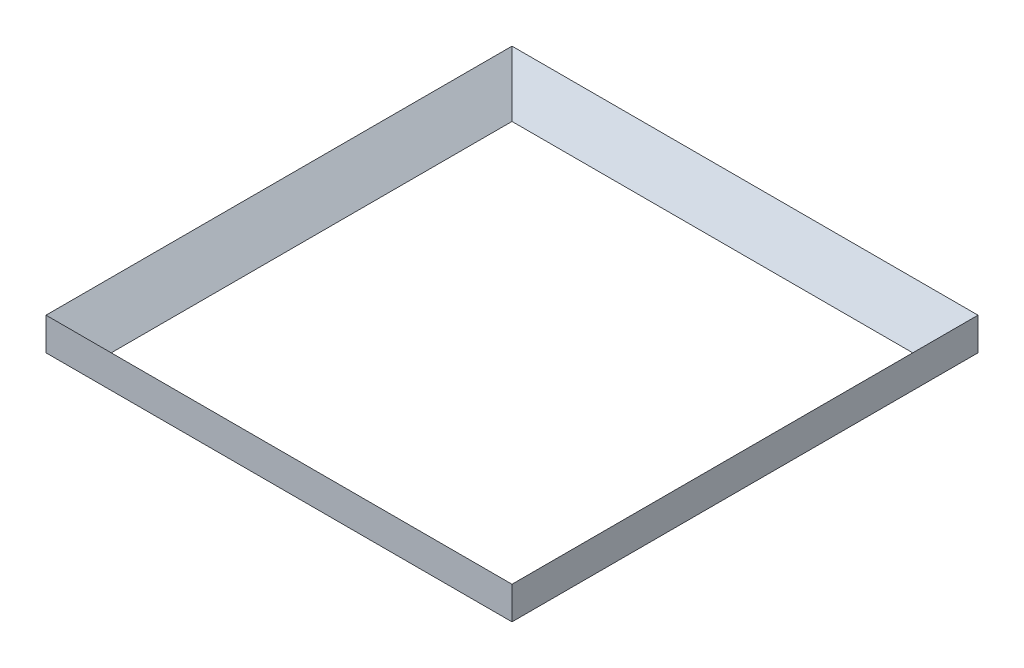
ISO-10303-21;
HEADER;
FILE_DESCRIPTION(('STEP AP214'),'2;1');
FILE_NAME('part.step','',(''),(''),'','','');
FILE_SCHEMA(('AUTOMOTIVE_DESIGN { 1 0 10303 214 1 1 1 1 }'));
ENDSEC;
DATA;
#1=APPLICATION_CONTEXT('core data for automotive mechanical design processes');
#2=APPLICATION_PROTOCOL_DEFINITION('international standard','automotive_design',2000,#1);
#3=PRODUCT_CONTEXT('',#1,'mechanical');
#4=PRODUCT('Part','Part','',(#3));
#5=PRODUCT_RELATED_PRODUCT_CATEGORY('part','',(#4));
#6=PRODUCT_DEFINITION_FORMATION('','',#4);
#7=PRODUCT_DEFINITION_CONTEXT('part definition',#1,'design');
#8=PRODUCT_DEFINITION('design','',#6,#7);
#9=PRODUCT_DEFINITION_SHAPE('','',#8);
#10=(LENGTH_UNIT() NAMED_UNIT(*) SI_UNIT(.MILLI.,.METRE.));
#11=(NAMED_UNIT(*) PLANE_ANGLE_UNIT() SI_UNIT($,.RADIAN.));
#12=(NAMED_UNIT(*) SI_UNIT($,.STERADIAN.) SOLID_ANGLE_UNIT());
#13=UNCERTAINTY_MEASURE_WITH_UNIT(LENGTH_MEASURE(1.E-05),#10,'distance_accuracy_value','');
#14=(GEOMETRIC_REPRESENTATION_CONTEXT(3) GLOBAL_UNCERTAINTY_ASSIGNED_CONTEXT((#13)) GLOBAL_UNIT_ASSIGNED_CONTEXT((#10,
#11,#12)) REPRESENTATION_CONTEXT('',''));
#15=CARTESIAN_POINT('',(0.,0.,0.));
#16=DIRECTION('',(0.,0.,1.));
#17=DIRECTION('',(1.,0.,0.));
#18=AXIS2_PLACEMENT_3D('',#15,#16,#17);
#19=CARTESIAN_POINT('',(50.,3.5,0.));
#20=DIRECTION('',(1.,0.,0.));
#21=DIRECTION('',(0.,0.,-1.));
#22=AXIS2_PLACEMENT_3D('',#19,#20,#21);
#23=PLANE('',#22);
#24=DIRECTION('',(0.,0.,1.));
#25=VECTOR('',#24,1.);
#26=CARTESIAN_POINT('',(50.,0.,0.));
#27=LINE('',#26,#25);
#28=CARTESIAN_POINT('',(50.,0.,-50.));
#29=VERTEX_POINT('',#28);
#30=CARTESIAN_POINT('',(50.,0.,0.));
#31=VERTEX_POINT('',#30);
#32=EDGE_CURVE('E94',#29,#31,#27,.T.);
#33=ORIENTED_EDGE('',*,*,#32,.F.);
#34=DIRECTION('',(0.,-1.,0.));
#35=VECTOR('',#34,1.);
#36=CARTESIAN_POINT('',(50.,3.5,-50.));
#37=LINE('',#36,#35);
#38=CARTESIAN_POINT('',(50.,3.5,-50.));
#39=VERTEX_POINT('',#38);
#40=EDGE_CURVE('E11',#39,#29,#37,.T.);
#41=ORIENTED_EDGE('',*,*,#40,.F.);
#42=DIRECTION('',(0.,0.,1.));
#43=VECTOR('',#42,1.);
#44=CARTESIAN_POINT('',(50.,3.5,0.));
#45=LINE('',#44,#43);
#46=CARTESIAN_POINT('',(50.,3.5,0.));
#47=VERTEX_POINT('',#46);
#48=EDGE_CURVE('E54',#39,#47,#45,.T.);
#49=ORIENTED_EDGE('',*,*,#48,.T.);
#50=DIRECTION('',(0.,-1.,0.));
#51=VECTOR('',#50,1.);
#52=CARTESIAN_POINT('',(50.,3.5,0.));
#53=LINE('',#52,#51);
#54=EDGE_CURVE('E86',#47,#31,#53,.T.);
#55=ORIENTED_EDGE('',*,*,#54,.T.);
#56=EDGE_LOOP('',(#33,#41,#49,#55));
#57=FACE_BOUND('',#56,.T.);
#58=ADVANCED_FACE('F39',(#57),#23,.T.);
#59=CARTESIAN_POINT('',(0.,3.5,-50.));
#60=DIRECTION('',(0.,0.,-1.));
#61=DIRECTION('',(-1.,0.,0.));
#62=AXIS2_PLACEMENT_3D('',#59,#60,#61);
#63=PLANE('',#62);
#64=DIRECTION('',(1.,0.,0.));
#65=VECTOR('',#64,1.);
#66=CARTESIAN_POINT('',(0.,0.,-50.));
#67=LINE('',#66,#65);
#68=CARTESIAN_POINT('',(0.,0.,-50.));
#69=VERTEX_POINT('',#68);
#70=EDGE_CURVE('E99',#69,#29,#67,.T.);
#71=ORIENTED_EDGE('',*,*,#70,.F.);
#72=DIRECTION('',(0.,-1.,0.));
#73=VECTOR('',#72,1.);
#74=CARTESIAN_POINT('',(0.,3.5,-50.));
#75=LINE('',#74,#73);
#76=CARTESIAN_POINT('',(0.,3.5,-50.));
#77=VERTEX_POINT('',#76);
#78=EDGE_CURVE('E47',#77,#69,#75,.T.);
#79=ORIENTED_EDGE('',*,*,#78,.F.);
#80=DIRECTION('',(1.,0.,0.));
#81=VECTOR('',#80,1.);
#82=CARTESIAN_POINT('',(0.,3.5,-50.));
#83=LINE('',#82,#81);
#84=EDGE_CURVE('E111',#77,#39,#83,.T.);
#85=ORIENTED_EDGE('',*,*,#84,.T.);
#86=ORIENTED_EDGE('',*,*,#40,.T.);
#87=EDGE_LOOP('',(#71,#79,#85,#86));
#88=FACE_BOUND('',#87,.T.);
#89=ADVANCED_FACE('F156',(#88),#63,.T.);
#90=CARTESIAN_POINT('',(0.,3.5,0.));
#91=DIRECTION('',(-1.,0.,0.));
#92=DIRECTION('',(0.,0.,1.));
#93=AXIS2_PLACEMENT_3D('',#90,#91,#92);
#94=PLANE('',#93);
#95=DIRECTION('',(0.,0.,-1.));
#96=VECTOR('',#95,1.);
#97=CARTESIAN_POINT('',(0.,0.,0.));
#98=LINE('',#97,#96);
#99=CARTESIAN_POINT('',(0.,0.,0.));
#100=VERTEX_POINT('',#99);
#101=EDGE_CURVE('E92',#100,#69,#98,.T.);
#102=ORIENTED_EDGE('',*,*,#101,.F.);
#103=DIRECTION('',(0.,-1.,0.));
#104=VECTOR('',#103,1.);
#105=CARTESIAN_POINT('',(0.,3.5,0.));
#106=LINE('',#105,#104);
#107=CARTESIAN_POINT('',(0.,3.5,0.));
#108=VERTEX_POINT('',#107);
#109=EDGE_CURVE('E74',#108,#100,#106,.T.);
#110=ORIENTED_EDGE('',*,*,#109,.F.);
#111=DIRECTION('',(0.,0.,-1.));
#112=VECTOR('',#111,1.);
#113=CARTESIAN_POINT('',(0.,3.5,0.));
#114=LINE('',#113,#112);
#115=EDGE_CURVE('E105',#108,#77,#114,.T.);
#116=ORIENTED_EDGE('',*,*,#115,.T.);
#117=ORIENTED_EDGE('',*,*,#78,.T.);
#118=EDGE_LOOP('',(#102,#110,#116,#117));
#119=FACE_BOUND('',#118,.T.);
#120=ADVANCED_FACE('F96',(#119),#94,.T.);
#121=CARTESIAN_POINT('',(0.,3.5,0.));
#122=DIRECTION('',(0.,0.,-1.));
#123=DIRECTION('',(-1.,0.,0.));
#124=AXIS2_PLACEMENT_3D('',#121,#122,#123);
#125=PLANE('',#124);
#126=DIRECTION('',(1.,0.,0.));
#127=VECTOR('',#126,1.);
#128=CARTESIAN_POINT('',(0.,0.,0.));
#129=LINE('',#128,#127);
#130=EDGE_CURVE('E78',#100,#31,#129,.T.);
#131=ORIENTED_EDGE('',*,*,#130,.T.);
#132=ORIENTED_EDGE('',*,*,#54,.F.);
#133=DIRECTION('',(1.,0.,0.));
#134=VECTOR('',#133,1.);
#135=CARTESIAN_POINT('',(0.,3.5,0.));
#136=LINE('',#135,#134);
#137=EDGE_CURVE('E82',#108,#47,#136,.T.);
#138=ORIENTED_EDGE('',*,*,#137,.F.);
#139=ORIENTED_EDGE('',*,*,#109,.T.);
#140=EDGE_LOOP('',(#131,#132,#138,#139));
#141=FACE_BOUND('',#140,.T.);
#142=ADVANCED_FACE('F76',(#141),#125,.F.);
#143=CARTESIAN_POINT('',(0.,0.,0.));
#144=DIRECTION('',(0.,1.,0.));
#145=DIRECTION('',(0.,0.,1.));
#146=AXIS2_PLACEMENT_3D('',#143,#144,#145);
#147=PLANE('',#146);
#148=DIRECTION('',(1.,0.,0.));
#149=VECTOR('',#148,1.);
#150=CARTESIAN_POINT('',(0.,0.,-3.5));
#151=LINE('',#150,#149);
#152=CARTESIAN_POINT('',(3.5,0.,-3.5));
#153=VERTEX_POINT('',#152);
#154=CARTESIAN_POINT('',(46.5,0.,-3.5));
#155=VERTEX_POINT('',#154);
#156=EDGE_CURVE('E115',#153,#155,#151,.T.);
#157=ORIENTED_EDGE('',*,*,#156,.T.);
#158=DIRECTION('',(0.,0.,1.));
#159=VECTOR('',#158,1.);
#160=CARTESIAN_POINT('',(46.5,0.,0.));
#161=LINE('',#160,#159);
#162=CARTESIAN_POINT('',(46.5,0.,-46.5));
#163=VERTEX_POINT('',#162);
#164=EDGE_CURVE('E124',#163,#155,#161,.T.);
#165=ORIENTED_EDGE('',*,*,#164,.F.);
#166=DIRECTION('',(1.,0.,0.));
#167=VECTOR('',#166,1.);
#168=CARTESIAN_POINT('',(0.,0.,-46.5));
#169=LINE('',#168,#167);
#170=CARTESIAN_POINT('',(3.5,0.,-46.5));
#171=VERTEX_POINT('',#170);
#172=EDGE_CURVE('E121',#171,#163,#169,.T.);
#173=ORIENTED_EDGE('',*,*,#172,.F.);
#174=DIRECTION('',(0.,0.,-1.));
#175=VECTOR('',#174,1.);
#176=CARTESIAN_POINT('',(3.5,0.,0.));
#177=LINE('',#176,#175);
#178=EDGE_CURVE('E118',#153,#171,#177,.T.);
#179=ORIENTED_EDGE('',*,*,#178,.F.);
#180=EDGE_LOOP('',(#157,#165,#173,#179));
#181=FACE_BOUND('',#180,.T.);
#182=ORIENTED_EDGE('',*,*,#32,.T.);
#183=ORIENTED_EDGE('',*,*,#130,.F.);
#184=ORIENTED_EDGE('',*,*,#101,.T.);
#185=ORIENTED_EDGE('',*,*,#70,.T.);
#186=EDGE_LOOP('',(#182,#183,#184,#185));
#187=FACE_BOUND('',#186,.T.);
#188=ADVANCED_FACE('F90',(#181,#187),#147,.F.);
#189=CARTESIAN_POINT('',(3.5,0.,0.));
#190=DIRECTION('',(-0.707106781186546,-0.707106781186549,0.));
#191=DIRECTION('',(0.707106781186549,-0.707106781186546,0.));
#192=AXIS2_PLACEMENT_3D('',#189,#190,#191);
#193=PLANE('',#192);
#194=ORIENTED_EDGE('',*,*,#178,.T.);
#195=DIRECTION('',(0.577350269189627,-0.577350269189624,0.577350269189627));
#196=VECTOR('',#195,1.);
#197=CARTESIAN_POINT('',(19.,-15.5,-31.));
#198=LINE('',#197,#196);
#199=EDGE_CURVE('E147',#77,#171,#198,.T.);
#200=ORIENTED_EDGE('',*,*,#199,.F.);
#201=ORIENTED_EDGE('',*,*,#115,.F.);
#202=DIRECTION('',(-0.577350269189627,0.577350269189624,0.577350269189627));
#203=VECTOR('',#202,1.);
#204=CARTESIAN_POINT('',(2.33333333333333,1.16666666666667,-2.33333333333333));
#205=LINE('',#204,#203);
#206=EDGE_CURVE('E119',#108,#153,#205,.F.);
#207=ORIENTED_EDGE('',*,*,#206,.T.);
#208=EDGE_LOOP('',(#194,#200,#201,#207));
#209=FACE_BOUND('',#208,.T.);
#210=ADVANCED_FACE('F149',(#209),#193,.F.);
#211=CARTESIAN_POINT('',(0.,0.,-3.5));
#212=DIRECTION('',(0.,-0.707106781186549,0.707106781186546));
#213=DIRECTION('',(0.,-0.707106781186546,-0.707106781186549));
#214=AXIS2_PLACEMENT_3D('',#211,#212,#213);
#215=PLANE('',#214);
#216=ORIENTED_EDGE('',*,*,#156,.F.);
#217=ORIENTED_EDGE('',*,*,#206,.F.);
#218=ORIENTED_EDGE('',*,*,#137,.T.);
#219=DIRECTION('',(0.577350269189627,0.577350269189624,0.577350269189627));
#220=VECTOR('',#219,1.);
#221=CARTESIAN_POINT('',(31.,-15.5,-19.));
#222=LINE('',#221,#220);
#223=EDGE_CURVE('E129',#47,#155,#222,.F.);
#224=ORIENTED_EDGE('',*,*,#223,.T.);
#225=EDGE_LOOP('',(#216,#217,#218,#224));
#226=FACE_BOUND('',#225,.T.);
#227=ADVANCED_FACE('F138',(#226),#215,.F.);
#228=CARTESIAN_POINT('',(46.5,0.,0.));
#229=DIRECTION('',(0.707106781186546,-0.707106781186549,0.));
#230=DIRECTION('',(0.707106781186549,0.707106781186546,0.));
#231=AXIS2_PLACEMENT_3D('',#228,#229,#230);
#232=PLANE('',#231);
#233=ORIENTED_EDGE('',*,*,#164,.T.);
#234=ORIENTED_EDGE('',*,*,#223,.F.);
#235=ORIENTED_EDGE('',*,*,#48,.F.);
#236=DIRECTION('',(-0.577350269189626,-0.577350269189624,0.577350269189627));
#237=VECTOR('',#236,1.);
#238=CARTESIAN_POINT('',(31.,-15.5,-31.));
#239=LINE('',#238,#237);
#240=EDGE_CURVE('E131',#39,#163,#239,.T.);
#241=ORIENTED_EDGE('',*,*,#240,.T.);
#242=EDGE_LOOP('',(#233,#234,#235,#241));
#243=FACE_BOUND('',#242,.T.);
#244=ADVANCED_FACE('F128',(#243),#232,.F.);
#245=CARTESIAN_POINT('',(0.,0.,-46.5));
#246=DIRECTION('',(0.,-0.707106781186549,-0.707106781186546));
#247=DIRECTION('',(0.,0.707106781186546,-0.707106781186549));
#248=AXIS2_PLACEMENT_3D('',#245,#246,#247);
#249=PLANE('',#248);
#250=ORIENTED_EDGE('',*,*,#172,.T.);
#251=ORIENTED_EDGE('',*,*,#240,.F.);
#252=ORIENTED_EDGE('',*,*,#84,.F.);
#253=ORIENTED_EDGE('',*,*,#199,.T.);
#254=EDGE_LOOP('',(#250,#251,#252,#253));
#255=FACE_BOUND('',#254,.T.);
#256=ADVANCED_FACE('F153',(#255),#249,.F.);
#257=CLOSED_SHELL('',(#58,#89,#120,#142,#188,#210,#227,#244,#256));
#258=MANIFOLD_SOLID_BREP('B2',#257);
#259=ADVANCED_BREP_SHAPE_REPRESENTATION('',(#18,#258),#14);
#260=SHAPE_DEFINITION_REPRESENTATION(#9,#259);
ENDSEC;
END-ISO-10303-21;
